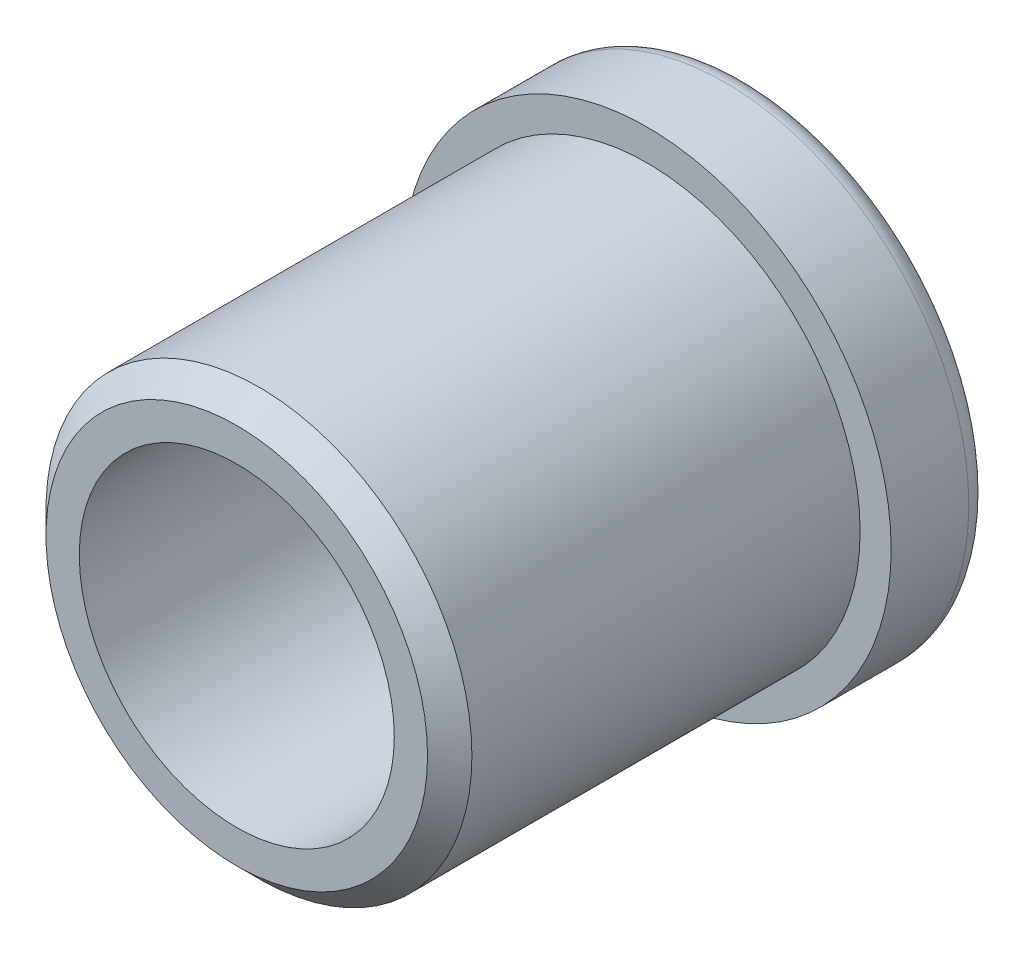
ISO-10303-21;
HEADER;
FILE_DESCRIPTION(('STEP AP214'),'2;1');
FILE_NAME('part.step','',(''),(''),'','','');
FILE_SCHEMA(('AUTOMOTIVE_DESIGN { 1 0 10303 214 1 1 1 1 }'));
ENDSEC;
DATA;
#1=APPLICATION_CONTEXT('core data for automotive mechanical design processes');
#2=APPLICATION_PROTOCOL_DEFINITION('international standard','automotive_design',2000,#1);
#3=PRODUCT_CONTEXT('',#1,'mechanical');
#4=PRODUCT('Part','Part','',(#3));
#5=PRODUCT_RELATED_PRODUCT_CATEGORY('part','',(#4));
#6=PRODUCT_DEFINITION_FORMATION('','',#4);
#7=PRODUCT_DEFINITION_CONTEXT('part definition',#1,'design');
#8=PRODUCT_DEFINITION('design','',#6,#7);
#9=PRODUCT_DEFINITION_SHAPE('','',#8);
#10=(LENGTH_UNIT() NAMED_UNIT(*) SI_UNIT(.MILLI.,.METRE.));
#11=(NAMED_UNIT(*) PLANE_ANGLE_UNIT() SI_UNIT($,.RADIAN.));
#12=(NAMED_UNIT(*) SI_UNIT($,.STERADIAN.) SOLID_ANGLE_UNIT());
#13=UNCERTAINTY_MEASURE_WITH_UNIT(LENGTH_MEASURE(1.E-05),#10,'distance_accuracy_value','');
#14=(GEOMETRIC_REPRESENTATION_CONTEXT(3) GLOBAL_UNCERTAINTY_ASSIGNED_CONTEXT((#13)) GLOBAL_UNIT_ASSIGNED_CONTEXT((#10,
#11,#12)) REPRESENTATION_CONTEXT('',''));
#15=CARTESIAN_POINT('',(0.,0.,0.));
#16=DIRECTION('',(0.,0.,1.));
#17=DIRECTION('',(1.,0.,0.));
#18=AXIS2_PLACEMENT_3D('',#15,#16,#17);
#19=CARTESIAN_POINT('',(0.,0.,3.));
#20=DIRECTION('',(0.,0.,-1.));
#21=DIRECTION('',(-1.,0.,0.));
#22=AXIS2_PLACEMENT_3D('',#19,#20,#21);
#23=CYLINDRICAL_SURFACE('',#22,6.6);
#24=CARTESIAN_POINT('',(0.,0.,9.89999999999998));
#25=DIRECTION('',(0.,0.,-1.));
#26=DIRECTION('',(-1.,0.,0.));
#27=AXIS2_PLACEMENT_3D('',#24,#25,#26);
#28=CIRCLE('',#27,6.6);
#29=CARTESIAN_POINT('',(-6.6,0.,9.89999999999998));
#30=VERTEX_POINT('',#29);
#31=EDGE_CURVE('E10',#30,#30,#28,.T.);
#32=ORIENTED_EDGE('',*,*,#31,.T.);
#33=EDGE_LOOP('',(#32));
#34=FACE_BOUND('',#33,.T.);
#35=CARTESIAN_POINT('',(0.,0.,11.5));
#36=DIRECTION('',(0.,0.,1.));
#37=DIRECTION('',(1.,0.,0.));
#38=AXIS2_PLACEMENT_3D('',#35,#36,#37);
#39=CIRCLE('',#38,6.6);
#40=CARTESIAN_POINT('',(6.6,0.,11.5));
#41=VERTEX_POINT('',#40);
#42=EDGE_CURVE('E75',#41,#41,#39,.T.);
#43=ORIENTED_EDGE('',*,*,#42,.T.);
#44=EDGE_LOOP('',(#43));
#45=FACE_BOUND('',#44,.T.);
#46=ADVANCED_FACE('F31',(#34,#45),#23,.F.);
#47=CARTESIAN_POINT('',(0.,0.,0.));
#48=DIRECTION('',(0.,0.,1.));
#49=DIRECTION('',(1.,0.,0.));
#50=AXIS2_PLACEMENT_3D('',#47,#48,#49);
#51=PLANE('',#50);
#52=CARTESIAN_POINT('',(0.,0.,0.));
#53=DIRECTION('',(0.,0.,1.));
#54=DIRECTION('',(1.,0.,0.));
#55=AXIS2_PLACEMENT_3D('',#52,#53,#54);
#56=CIRCLE('',#55,8.5);
#57=CARTESIAN_POINT('',(8.5,0.,0.));
#58=VERTEX_POINT('',#57);
#59=EDGE_CURVE('E38',#58,#58,#56,.T.);
#60=ORIENTED_EDGE('',*,*,#59,.T.);
#61=EDGE_LOOP('',(#60));
#62=FACE_BOUND('',#61,.T.);
#63=CARTESIAN_POINT('',(0.,0.,0.));
#64=DIRECTION('',(0.,0.,1.));
#65=DIRECTION('',(1.,0.,0.));
#66=AXIS2_PLACEMENT_3D('',#63,#64,#65);
#67=CIRCLE('',#66,10.);
#68=CARTESIAN_POINT('',(10.,0.,0.));
#69=VERTEX_POINT('',#68);
#70=EDGE_CURVE('E54',#69,#69,#67,.F.);
#71=ORIENTED_EDGE('',*,*,#70,.T.);
#72=EDGE_LOOP('',(#71));
#73=FACE_BOUND('',#72,.T.);
#74=ADVANCED_FACE('F97',(#62,#73),#51,.F.);
#75=CARTESIAN_POINT('',(0.,0.,3.));
#76=DIRECTION('',(0.,0.,-1.));
#77=DIRECTION('',(-1.,0.,0.));
#78=AXIS2_PLACEMENT_3D('',#75,#76,#77);
#79=CYLINDRICAL_SURFACE('',#78,11.);
#80=CARTESIAN_POINT('',(0.,0.,1.));
#81=DIRECTION('',(0.,0.,1.));
#82=DIRECTION('',(1.,0.,0.));
#83=AXIS2_PLACEMENT_3D('',#80,#81,#82);
#84=CIRCLE('',#83,11.);
#85=CARTESIAN_POINT('',(11.,0.,1.));
#86=VERTEX_POINT('',#85);
#87=EDGE_CURVE('E57',#86,#86,#84,.T.);
#88=ORIENTED_EDGE('',*,*,#87,.T.);
#89=EDGE_LOOP('',(#88));
#90=FACE_BOUND('',#89,.T.);
#91=CARTESIAN_POINT('',(0.,0.,4.5));
#92=DIRECTION('',(0.,0.,1.));
#93=DIRECTION('',(1.,0.,0.));
#94=AXIS2_PLACEMENT_3D('',#91,#92,#93);
#95=CIRCLE('',#94,11.);
#96=CARTESIAN_POINT('',(11.,0.,4.5));
#97=VERTEX_POINT('',#96);
#98=EDGE_CURVE('E69',#97,#97,#95,.T.);
#99=ORIENTED_EDGE('',*,*,#98,.F.);
#100=EDGE_LOOP('',(#99));
#101=FACE_BOUND('',#100,.T.);
#102=ADVANCED_FACE('F102',(#90,#101),#79,.T.);
#103=CARTESIAN_POINT('',(0.,0.,23.));
#104=DIRECTION('',(0.,0.,1.));
#105=DIRECTION('',(1.,0.,0.));
#106=AXIS2_PLACEMENT_3D('',#103,#104,#105);
#107=PLANE('',#106);
#108=CARTESIAN_POINT('',(0.,0.,23.));
#109=DIRECTION('',(0.,0.,1.));
#110=DIRECTION('',(1.,0.,0.));
#111=AXIS2_PLACEMENT_3D('',#108,#109,#110);
#112=CIRCLE('',#111,8.6);
#113=CARTESIAN_POINT('',(8.6,0.,23.));
#114=VERTEX_POINT('',#113);
#115=EDGE_CURVE('E63',#114,#114,#112,.T.);
#116=ORIENTED_EDGE('',*,*,#115,.T.);
#117=EDGE_LOOP('',(#116));
#118=FACE_BOUND('',#117,.T.);
#119=CARTESIAN_POINT('',(0.,0.,23.));
#120=DIRECTION('',(0.,0.,1.));
#121=DIRECTION('',(1.,0.,0.));
#122=AXIS2_PLACEMENT_3D('',#119,#120,#121);
#123=CIRCLE('',#122,7.1);
#124=CARTESIAN_POINT('',(7.1,0.,23.));
#125=VERTEX_POINT('',#124);
#126=EDGE_CURVE('E66',#125,#125,#123,.T.);
#127=ORIENTED_EDGE('',*,*,#126,.F.);
#128=EDGE_LOOP('',(#127));
#129=FACE_BOUND('',#128,.T.);
#130=ADVANCED_FACE('F110',(#118,#129),#107,.T.);
#131=CARTESIAN_POINT('',(0.,0.,23.));
#132=DIRECTION('',(0.,0.,-1.));
#133=DIRECTION('',(-1.,0.,0.));
#134=AXIS2_PLACEMENT_3D('',#131,#132,#133);
#135=CYLINDRICAL_SURFACE('',#134,9.6);
#136=CARTESIAN_POINT('',(0.,0.,4.5));
#137=DIRECTION('',(0.,0.,1.));
#138=DIRECTION('',(1.,0.,0.));
#139=AXIS2_PLACEMENT_3D('',#136,#137,#138);
#140=CIRCLE('',#139,9.6);
#141=CARTESIAN_POINT('',(9.6,0.,4.5));
#142=VERTEX_POINT('',#141);
#143=EDGE_CURVE('E72',#142,#142,#140,.T.);
#144=ORIENTED_EDGE('',*,*,#143,.T.);
#145=EDGE_LOOP('',(#144));
#146=FACE_BOUND('',#145,.T.);
#147=CARTESIAN_POINT('',(0.,0.,22.));
#148=DIRECTION('',(0.,0.,1.));
#149=DIRECTION('',(1.,0.,0.));
#150=AXIS2_PLACEMENT_3D('',#147,#148,#149);
#151=CIRCLE('',#150,9.6);
#152=CARTESIAN_POINT('',(9.6,0.,22.));
#153=VERTEX_POINT('',#152);
#154=EDGE_CURVE('E60',#153,#153,#151,.F.);
#155=ORIENTED_EDGE('',*,*,#154,.T.);
#156=EDGE_LOOP('',(#155));
#157=FACE_BOUND('',#156,.T.);
#158=ADVANCED_FACE('F105',(#146,#157),#135,.T.);
#159=CARTESIAN_POINT('',(0.,0.,23.));
#160=DIRECTION('',(0.,0.,-1.));
#161=DIRECTION('',(-1.,0.,0.));
#162=AXIS2_PLACEMENT_3D('',#159,#160,#161);
#163=CYLINDRICAL_SURFACE('',#162,7.1);
#164=CARTESIAN_POINT('',(0.,0.,11.5));
#165=DIRECTION('',(0.,0.,1.));
#166=DIRECTION('',(1.,0.,0.));
#167=AXIS2_PLACEMENT_3D('',#164,#165,#166);
#168=CIRCLE('',#167,7.1);
#169=CARTESIAN_POINT('',(7.1,0.,11.5));
#170=VERTEX_POINT('',#169);
#171=EDGE_CURVE('E51',#170,#170,#168,.T.);
#172=ORIENTED_EDGE('',*,*,#171,.F.);
#173=EDGE_LOOP('',(#172));
#174=FACE_BOUND('',#173,.T.);
#175=ORIENTED_EDGE('',*,*,#126,.T.);
#176=EDGE_LOOP('',(#175));
#177=FACE_BOUND('',#176,.T.);
#178=ADVANCED_FACE('F115',(#174,#177),#163,.F.);
#179=CARTESIAN_POINT('',(0.,0.,23.));
#180=DIRECTION('',(0.,0.,-1.));
#181=DIRECTION('',(-1.,0.,0.));
#182=AXIS2_PLACEMENT_3D('',#179,#180,#181);
#183=CONICAL_SURFACE('',#182,8.6,0.785398163397447);
#184=ORIENTED_EDGE('',*,*,#154,.F.);
#185=EDGE_LOOP('',(#184));
#186=FACE_BOUND('',#185,.T.);
#187=ORIENTED_EDGE('',*,*,#115,.F.);
#188=EDGE_LOOP('',(#187));
#189=FACE_BOUND('',#188,.T.);
#190=ADVANCED_FACE('F112',(#186,#189),#183,.T.);
#191=CARTESIAN_POINT('',(0.,0.,1.));
#192=DIRECTION('',(0.,0.,1.));
#193=DIRECTION('',(1.,0.,0.));
#194=AXIS2_PLACEMENT_3D('',#191,#192,#193);
#195=TOROIDAL_SURFACE('',#194,10.,1.);
#196=ORIENTED_EDGE('',*,*,#70,.F.);
#197=EDGE_LOOP('',(#196));
#198=FACE_BOUND('',#197,.T.);
#199=ORIENTED_EDGE('',*,*,#87,.F.);
#200=EDGE_LOOP('',(#199));
#201=FACE_BOUND('',#200,.T.);
#202=ADVANCED_FACE('F93',(#198,#201),#195,.T.);
#203=CARTESIAN_POINT('',(0.,0.,4.5));
#204=DIRECTION('',(0.,0.,1.));
#205=DIRECTION('',(1.,0.,0.));
#206=AXIS2_PLACEMENT_3D('',#203,#204,#205);
#207=PLANE('',#206);
#208=ORIENTED_EDGE('',*,*,#98,.T.);
#209=EDGE_LOOP('',(#208));
#210=FACE_BOUND('',#209,.T.);
#211=ORIENTED_EDGE('',*,*,#143,.F.);
#212=EDGE_LOOP('',(#211));
#213=FACE_BOUND('',#212,.T.);
#214=ADVANCED_FACE('F83',(#210,#213),#207,.T.);
#215=CARTESIAN_POINT('',(0.,0.,11.5));
#216=DIRECTION('',(0.,0.,1.));
#217=DIRECTION('',(1.,0.,0.));
#218=AXIS2_PLACEMENT_3D('',#215,#216,#217);
#219=PLANE('',#218);
#220=ORIENTED_EDGE('',*,*,#171,.T.);
#221=EDGE_LOOP('',(#220));
#222=FACE_BOUND('',#221,.T.);
#223=ORIENTED_EDGE('',*,*,#42,.F.);
#224=EDGE_LOOP('',(#223));
#225=FACE_BOUND('',#224,.T.);
#226=ADVANCED_FACE('F80',(#222,#225),#219,.T.);
#227=CARTESIAN_POINT('',(0.,0.,10.));
#228=DIRECTION('',(0.,0.,-1.));
#229=DIRECTION('',(-1.,0.,0.));
#230=AXIS2_PLACEMENT_3D('',#227,#228,#229);
#231=CYLINDRICAL_SURFACE('',#230,7.5);
#232=CARTESIAN_POINT('',(0.,0.,8.99999999999999));
#233=DIRECTION('',(0.,0.,-1.));
#234=DIRECTION('',(-1.,0.,0.));
#235=AXIS2_PLACEMENT_3D('',#232,#233,#234);
#236=CIRCLE('',#235,7.5);
#237=CARTESIAN_POINT('',(-7.5,0.,8.99999999999999));
#238=VERTEX_POINT('',#237);
#239=EDGE_CURVE('E42',#238,#238,#236,.F.);
#240=ORIENTED_EDGE('',*,*,#239,.T.);
#241=EDGE_LOOP('',(#240));
#242=FACE_BOUND('',#241,.T.);
#243=CARTESIAN_POINT('',(0.,0.,0.999999999999992));
#244=DIRECTION('',(0.,0.,1.));
#245=DIRECTION('',(1.,0.,0.));
#246=AXIS2_PLACEMENT_3D('',#243,#244,#245);
#247=CIRCLE('',#246,7.5);
#248=CARTESIAN_POINT('',(7.5,0.,0.999999999999992));
#249=VERTEX_POINT('',#248);
#250=EDGE_CURVE('E46',#249,#249,#247,.F.);
#251=ORIENTED_EDGE('',*,*,#250,.T.);
#252=EDGE_LOOP('',(#251));
#253=FACE_BOUND('',#252,.T.);
#254=ADVANCED_FACE('F82',(#242,#253),#231,.F.);
#255=CARTESIAN_POINT('',(0.,0.,10.));
#256=DIRECTION('',(0.,0.,-1.));
#257=DIRECTION('',(-1.,0.,0.));
#258=AXIS2_PLACEMENT_3D('',#255,#256,#257);
#259=CONICAL_SURFACE('',#258,6.49999999999998,0.785398163397453);
#260=ORIENTED_EDGE('',*,*,#239,.F.);
#261=EDGE_LOOP('',(#260));
#262=FACE_BOUND('',#261,.T.);
#263=ORIENTED_EDGE('',*,*,#31,.F.);
#264=EDGE_LOOP('',(#263));
#265=FACE_BOUND('',#264,.T.);
#266=ADVANCED_FACE('F90',(#262,#265),#259,.F.);
#267=CARTESIAN_POINT('',(0.,0.,0.999999999999992));
#268=DIRECTION('',(0.,0.,-1.));
#269=DIRECTION('',(-1.,0.,0.));
#270=AXIS2_PLACEMENT_3D('',#267,#268,#269);
#271=CONICAL_SURFACE('',#270,7.5,0.785398163397451);
#272=ORIENTED_EDGE('',*,*,#59,.F.);
#273=EDGE_LOOP('',(#272));
#274=FACE_BOUND('',#273,.T.);
#275=ORIENTED_EDGE('',*,*,#250,.F.);
#276=EDGE_LOOP('',(#275));
#277=FACE_BOUND('',#276,.T.);
#278=ADVANCED_FACE('F33',(#274,#277),#271,.F.);
#279=CLOSED_SHELL('',(#46,#74,#102,#130,#158,#178,#190,#202,#214,#226,#254,#266,#278));
#280=MANIFOLD_SOLID_BREP('B2',#279);
#281=ADVANCED_BREP_SHAPE_REPRESENTATION('',(#18,#280),#14);
#282=SHAPE_DEFINITION_REPRESENTATION(#9,#281);
ENDSEC;
END-ISO-10303-21;
